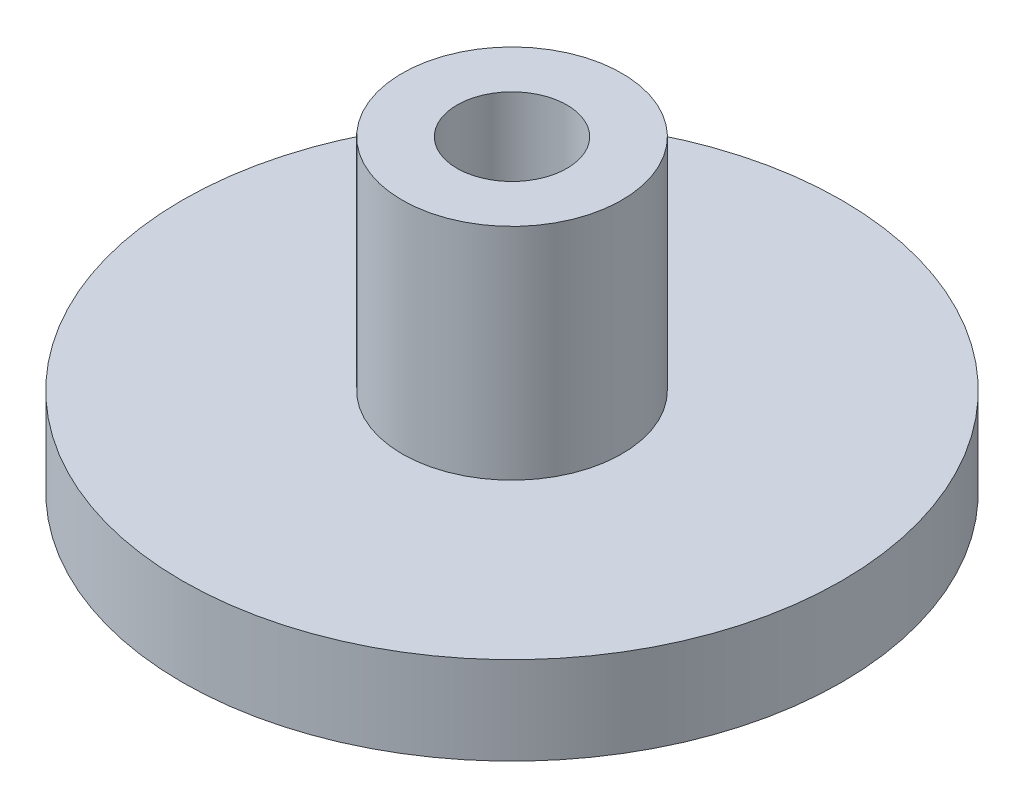
ISO-10303-21;
HEADER;
FILE_DESCRIPTION(('STEP AP214'),'2;1');
FILE_NAME('part.step','',(''),(''),'','','');
FILE_SCHEMA(('AUTOMOTIVE_DESIGN { 1 0 10303 214 1 1 1 1 }'));
ENDSEC;
DATA;
#1=APPLICATION_CONTEXT('core data for automotive mechanical design processes');
#2=APPLICATION_PROTOCOL_DEFINITION('international standard','automotive_design',2000,#1);
#3=PRODUCT_CONTEXT('',#1,'mechanical');
#4=PRODUCT('Part','Part','',(#3));
#5=PRODUCT_RELATED_PRODUCT_CATEGORY('part','',(#4));
#6=PRODUCT_DEFINITION_FORMATION('','',#4);
#7=PRODUCT_DEFINITION_CONTEXT('part definition',#1,'design');
#8=PRODUCT_DEFINITION('design','',#6,#7);
#9=PRODUCT_DEFINITION_SHAPE('','',#8);
#10=(LENGTH_UNIT() NAMED_UNIT(*) SI_UNIT(.MILLI.,.METRE.));
#11=(NAMED_UNIT(*) PLANE_ANGLE_UNIT() SI_UNIT($,.RADIAN.));
#12=(NAMED_UNIT(*) SI_UNIT($,.STERADIAN.) SOLID_ANGLE_UNIT());
#13=UNCERTAINTY_MEASURE_WITH_UNIT(LENGTH_MEASURE(1.E-05),#10,'distance_accuracy_value','');
#14=(GEOMETRIC_REPRESENTATION_CONTEXT(3) GLOBAL_UNCERTAINTY_ASSIGNED_CONTEXT((#13)) GLOBAL_UNIT_ASSIGNED_CONTEXT((#10,
#11,#12)) REPRESENTATION_CONTEXT('',''));
#15=CARTESIAN_POINT('',(0.,0.,0.));
#16=DIRECTION('',(0.,0.,1.));
#17=DIRECTION('',(1.,0.,0.));
#18=AXIS2_PLACEMENT_3D('',#15,#16,#17);
#19=CARTESIAN_POINT('',(0.,4.,0.));
#20=DIRECTION('',(0.,1.,0.));
#21=DIRECTION('',(0.,0.,1.));
#22=AXIS2_PLACEMENT_3D('',#19,#20,#21);
#23=PLANE('',#22);
#24=CARTESIAN_POINT('',(0.,4.,0.));
#25=DIRECTION('',(0.,1.,0.));
#26=DIRECTION('',(0.,0.,1.));
#27=AXIS2_PLACEMENT_3D('',#24,#25,#26);
#28=CIRCLE('',#27,15.);
#29=CARTESIAN_POINT('',(0.,4.,15.));
#30=VERTEX_POINT('',#29);
#31=EDGE_CURVE('E10',#30,#30,#28,.T.);
#32=ORIENTED_EDGE('',*,*,#31,.T.);
#33=EDGE_LOOP('',(#32));
#34=FACE_BOUND('',#33,.T.);
#35=CARTESIAN_POINT('',(0.,4.,0.));
#36=DIRECTION('',(0.,1.,0.));
#37=DIRECTION('',(0.,0.,1.));
#38=AXIS2_PLACEMENT_3D('',#35,#36,#37);
#39=CIRCLE('',#38,5.);
#40=CARTESIAN_POINT('',(0.,4.,5.));
#41=VERTEX_POINT('',#40);
#42=EDGE_CURVE('E55',#41,#41,#39,.T.);
#43=ORIENTED_EDGE('',*,*,#42,.F.);
#44=EDGE_LOOP('',(#43));
#45=FACE_BOUND('',#44,.T.);
#46=ADVANCED_FACE('F39',(#34,#45),#23,.T.);
#47=CARTESIAN_POINT('',(0.,4.,0.));
#48=DIRECTION('',(0.,-1.,0.));
#49=DIRECTION('',(0.,0.,-1.));
#50=AXIS2_PLACEMENT_3D('',#47,#48,#49);
#51=CYLINDRICAL_SURFACE('',#50,2.5);
#52=CARTESIAN_POINT('',(0.,0.,0.));
#53=DIRECTION('',(0.,1.,0.));
#54=DIRECTION('',(0.,0.,1.));
#55=AXIS2_PLACEMENT_3D('',#52,#53,#54);
#56=CIRCLE('',#55,2.5);
#57=CARTESIAN_POINT('',(0.,0.,2.5));
#58=VERTEX_POINT('',#57);
#59=EDGE_CURVE('E53',#58,#58,#56,.T.);
#60=ORIENTED_EDGE('',*,*,#59,.F.);
#61=EDGE_LOOP('',(#60));
#62=FACE_BOUND('',#61,.T.);
#63=CARTESIAN_POINT('',(0.,14.,0.));
#64=DIRECTION('',(0.,1.,0.));
#65=DIRECTION('',(0.,0.,1.));
#66=AXIS2_PLACEMENT_3D('',#63,#64,#65);
#67=CIRCLE('',#66,2.5);
#68=CARTESIAN_POINT('',(0.,14.,2.5));
#69=VERTEX_POINT('',#68);
#70=EDGE_CURVE('E68',#69,#69,#67,.T.);
#71=ORIENTED_EDGE('',*,*,#70,.T.);
#72=EDGE_LOOP('',(#71));
#73=FACE_BOUND('',#72,.T.);
#74=ADVANCED_FACE('F41',(#62,#73),#51,.F.);
#75=CARTESIAN_POINT('',(0.,4.,0.));
#76=DIRECTION('',(0.,-1.,0.));
#77=DIRECTION('',(0.,0.,-1.));
#78=AXIS2_PLACEMENT_3D('',#75,#76,#77);
#79=CYLINDRICAL_SURFACE('',#78,15.);
#80=ORIENTED_EDGE('',*,*,#31,.F.);
#81=EDGE_LOOP('',(#80));
#82=FACE_BOUND('',#81,.T.);
#83=CARTESIAN_POINT('',(0.,0.,0.));
#84=DIRECTION('',(0.,1.,0.));
#85=DIRECTION('',(0.,0.,1.));
#86=AXIS2_PLACEMENT_3D('',#83,#84,#85);
#87=CIRCLE('',#86,15.);
#88=CARTESIAN_POINT('',(0.,0.,15.));
#89=VERTEX_POINT('',#88);
#90=EDGE_CURVE('E43',#89,#89,#87,.T.);
#91=ORIENTED_EDGE('',*,*,#90,.T.);
#92=EDGE_LOOP('',(#91));
#93=FACE_BOUND('',#92,.T.);
#94=ADVANCED_FACE('F86',(#82,#93),#79,.T.);
#95=CARTESIAN_POINT('',(0.,0.,0.));
#96=DIRECTION('',(0.,1.,0.));
#97=DIRECTION('',(0.,0.,1.));
#98=AXIS2_PLACEMENT_3D('',#95,#96,#97);
#99=PLANE('',#98);
#100=ORIENTED_EDGE('',*,*,#59,.T.);
#101=EDGE_LOOP('',(#100));
#102=FACE_BOUND('',#101,.T.);
#103=ORIENTED_EDGE('',*,*,#90,.F.);
#104=EDGE_LOOP('',(#103));
#105=FACE_BOUND('',#104,.T.);
#106=ADVANCED_FACE('F78',(#102,#105),#99,.F.);
#107=CARTESIAN_POINT('',(0.,14.,0.));
#108=DIRECTION('',(0.,1.,0.));
#109=DIRECTION('',(0.,0.,1.));
#110=AXIS2_PLACEMENT_3D('',#107,#108,#109);
#111=PLANE('',#110);
#112=CARTESIAN_POINT('',(0.,14.,0.));
#113=DIRECTION('',(0.,1.,0.));
#114=DIRECTION('',(0.,0.,1.));
#115=AXIS2_PLACEMENT_3D('',#112,#113,#114);
#116=CIRCLE('',#115,5.);
#117=CARTESIAN_POINT('',(0.,14.,5.));
#118=VERTEX_POINT('',#117);
#119=EDGE_CURVE('E59',#118,#118,#116,.T.);
#120=ORIENTED_EDGE('',*,*,#119,.T.);
#121=EDGE_LOOP('',(#120));
#122=FACE_BOUND('',#121,.T.);
#123=ORIENTED_EDGE('',*,*,#70,.F.);
#124=EDGE_LOOP('',(#123));
#125=FACE_BOUND('',#124,.T.);
#126=ADVANCED_FACE('F75',(#122,#125),#111,.T.);
#127=CARTESIAN_POINT('',(0.,14.,0.));
#128=DIRECTION('',(0.,-1.,0.));
#129=DIRECTION('',(0.,0.,-1.));
#130=AXIS2_PLACEMENT_3D('',#127,#128,#129);
#131=CYLINDRICAL_SURFACE('',#130,5.);
#132=ORIENTED_EDGE('',*,*,#119,.F.);
#133=EDGE_LOOP('',(#132));
#134=FACE_BOUND('',#133,.T.);
#135=ORIENTED_EDGE('',*,*,#42,.T.);
#136=EDGE_LOOP('',(#135));
#137=FACE_BOUND('',#136,.T.);
#138=ADVANCED_FACE('F77',(#134,#137),#131,.T.);
#139=CLOSED_SHELL('',(#46,#74,#94,#106,#126,#138));
#140=MANIFOLD_SOLID_BREP('B2',#139);
#141=ADVANCED_BREP_SHAPE_REPRESENTATION('',(#18,#140),#14);
#142=SHAPE_DEFINITION_REPRESENTATION(#9,#141);
ENDSEC;
END-ISO-10303-21;
